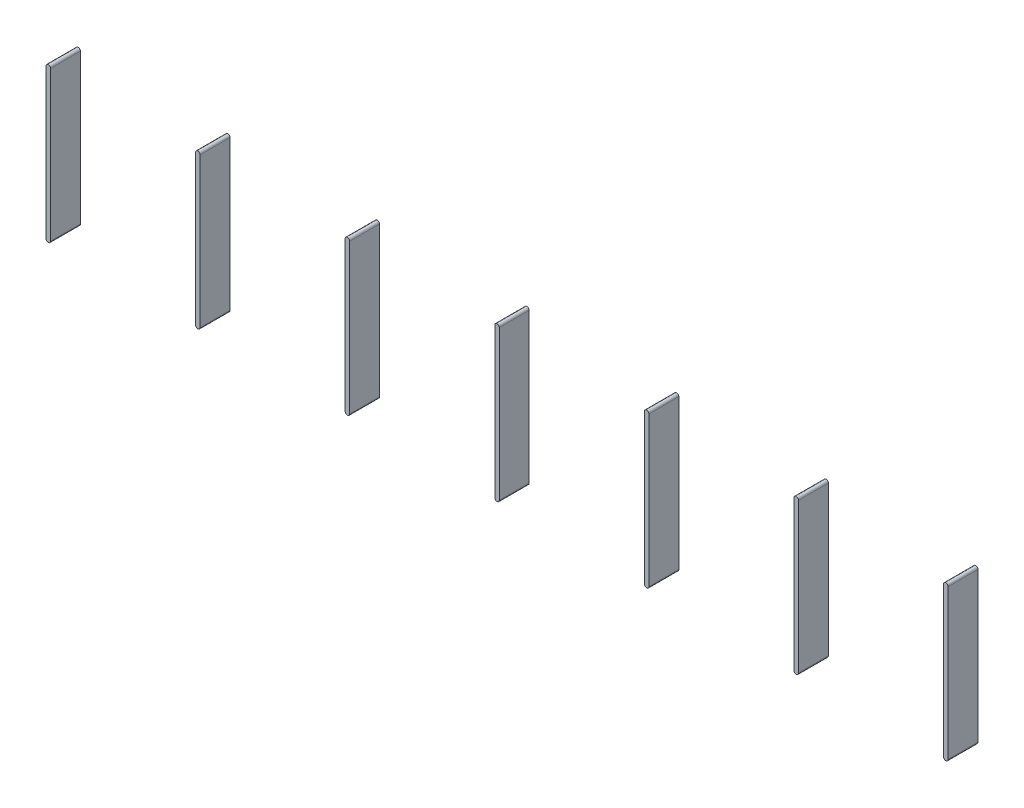
ISO-10303-21;
HEADER;
FILE_DESCRIPTION(('STEP AP214'),'2;1');
FILE_NAME('part.step','',(''),(''),'','','');
FILE_SCHEMA(('AUTOMOTIVE_DESIGN { 1 0 10303 214 1 1 1 1 }'));
ENDSEC;
DATA;
#1=APPLICATION_CONTEXT('core data for automotive mechanical design processes');
#2=APPLICATION_PROTOCOL_DEFINITION('international standard','automotive_design',2000,#1);
#3=PRODUCT_CONTEXT('',#1,'mechanical');
#4=PRODUCT('Part','Part','',(#3));
#5=PRODUCT_RELATED_PRODUCT_CATEGORY('part','',(#4));
#6=PRODUCT_DEFINITION_FORMATION('','',#4);
#7=PRODUCT_DEFINITION_CONTEXT('part definition',#1,'design');
#8=PRODUCT_DEFINITION('design','',#6,#7);
#9=PRODUCT_DEFINITION_SHAPE('','',#8);
#10=(LENGTH_UNIT() NAMED_UNIT(*) SI_UNIT(.MILLI.,.METRE.));
#11=(NAMED_UNIT(*) PLANE_ANGLE_UNIT() SI_UNIT($,.RADIAN.));
#12=(NAMED_UNIT(*) SI_UNIT($,.STERADIAN.) SOLID_ANGLE_UNIT());
#13=UNCERTAINTY_MEASURE_WITH_UNIT(LENGTH_MEASURE(1.E-05),#10,'distance_accuracy_value','');
#14=(GEOMETRIC_REPRESENTATION_CONTEXT(3) GLOBAL_UNCERTAINTY_ASSIGNED_CONTEXT((#13)) GLOBAL_UNIT_ASSIGNED_CONTEXT((#10,
#11,#12)) REPRESENTATION_CONTEXT('',''));
#15=CARTESIAN_POINT('',(0.,0.,0.));
#16=DIRECTION('',(0.,0.,1.));
#17=DIRECTION('',(1.,0.,0.));
#18=AXIS2_PLACEMENT_3D('',#15,#16,#17);
#19=CARTESIAN_POINT('',(-80.,0.,4.));
#20=DIRECTION('',(0.,0.,-1.));
#21=DIRECTION('',(-1.,0.,0.));
#22=AXIS2_PLACEMENT_3D('',#19,#20,#21);
#23=CYLINDRICAL_SURFACE('',#22,0.299999999999995);
#24=CARTESIAN_POINT('',(-80.,0.,0.));
#25=DIRECTION('',(0.,0.,1.));
#26=DIRECTION('',(1.,0.,0.));
#27=AXIS2_PLACEMENT_3D('',#24,#25,#26);
#28=CIRCLE('',#27,0.299999999999995);
#29=CARTESIAN_POINT('',(-79.7,0.,0.));
#30=VERTEX_POINT('',#29);
#31=CARTESIAN_POINT('',(-80.3,0.,0.));
#32=VERTEX_POINT('',#31);
#33=EDGE_CURVE('E107',#30,#32,#28,.T.);
#34=ORIENTED_EDGE('',*,*,#33,.T.);
#35=DIRECTION('',(0.,0.,-1.));
#36=VECTOR('',#35,1.);
#37=CARTESIAN_POINT('',(-80.3,0.,4.));
#38=LINE('',#37,#36);
#39=CARTESIAN_POINT('',(-80.3,0.,4.));
#40=VERTEX_POINT('',#39);
#41=EDGE_CURVE('E12',#40,#32,#38,.T.);
#42=ORIENTED_EDGE('',*,*,#41,.F.);
#43=CARTESIAN_POINT('',(-80.,0.,4.));
#44=DIRECTION('',(0.,0.,1.));
#45=DIRECTION('',(1.,0.,0.));
#46=AXIS2_PLACEMENT_3D('',#43,#44,#45);
#47=CIRCLE('',#46,0.299999999999995);
#48=CARTESIAN_POINT('',(-79.7,0.,4.));
#49=VERTEX_POINT('',#48);
#50=EDGE_CURVE('E95',#49,#40,#47,.T.);
#51=ORIENTED_EDGE('',*,*,#50,.F.);
#52=DIRECTION('',(0.,0.,-1.));
#53=VECTOR('',#52,1.);
#54=CARTESIAN_POINT('',(-79.7,0.,4.));
#55=LINE('',#54,#53);
#56=EDGE_CURVE('E103',#49,#30,#55,.T.);
#57=ORIENTED_EDGE('',*,*,#56,.T.);
#58=EDGE_LOOP('',(#34,#42,#51,#57));
#59=FACE_BOUND('',#58,.T.);
#60=ADVANCED_FACE('F44',(#59),#23,.T.);
#61=CARTESIAN_POINT('',(-80.3,0.,4.));
#62=DIRECTION('',(1.,0.,0.));
#63=DIRECTION('',(0.,0.,-1.));
#64=AXIS2_PLACEMENT_3D('',#61,#62,#63);
#65=PLANE('',#64);
#66=DIRECTION('',(0.,-1.,0.));
#67=VECTOR('',#66,1.);
#68=CARTESIAN_POINT('',(-80.3,0.,0.));
#69=LINE('',#68,#67);
#70=CARTESIAN_POINT('',(-80.3,-20.,0.));
#71=VERTEX_POINT('',#70);
#72=EDGE_CURVE('E99',#32,#71,#69,.T.);
#73=ORIENTED_EDGE('',*,*,#72,.T.);
#74=DIRECTION('',(0.,0.,-1.));
#75=VECTOR('',#74,1.);
#76=CARTESIAN_POINT('',(-80.3,-20.,4.));
#77=LINE('',#76,#75);
#78=CARTESIAN_POINT('',(-80.3,-20.,4.));
#79=VERTEX_POINT('',#78);
#80=EDGE_CURVE('E52',#79,#71,#77,.T.);
#81=ORIENTED_EDGE('',*,*,#80,.F.);
#82=DIRECTION('',(0.,-1.,0.));
#83=VECTOR('',#82,1.);
#84=CARTESIAN_POINT('',(-80.3,0.,4.));
#85=LINE('',#84,#83);
#86=EDGE_CURVE('E90',#40,#79,#85,.T.);
#87=ORIENTED_EDGE('',*,*,#86,.F.);
#88=ORIENTED_EDGE('',*,*,#41,.T.);
#89=EDGE_LOOP('',(#73,#81,#87,#88));
#90=FACE_BOUND('',#89,.T.);
#91=ADVANCED_FACE('F98',(#90),#65,.F.);
#92=CARTESIAN_POINT('',(-80.,-20.,4.));
#93=DIRECTION('',(0.,0.,-1.));
#94=DIRECTION('',(-1.,0.,0.));
#95=AXIS2_PLACEMENT_3D('',#92,#93,#94);
#96=CYLINDRICAL_SURFACE('',#95,0.299999999999995);
#97=CARTESIAN_POINT('',(-80.,-20.,0.));
#98=DIRECTION('',(0.,0.,1.));
#99=DIRECTION('',(1.,0.,0.));
#100=AXIS2_PLACEMENT_3D('',#97,#98,#99);
#101=CIRCLE('',#100,0.299999999999995);
#102=CARTESIAN_POINT('',(-79.7,-20.,0.));
#103=VERTEX_POINT('',#102);
#104=EDGE_CURVE('E77',#71,#103,#101,.T.);
#105=ORIENTED_EDGE('',*,*,#104,.T.);
#106=DIRECTION('',(0.,0.,-1.));
#107=VECTOR('',#106,1.);
#108=CARTESIAN_POINT('',(-79.7,-20.,4.));
#109=LINE('',#108,#107);
#110=CARTESIAN_POINT('',(-79.7,-20.,4.));
#111=VERTEX_POINT('',#110);
#112=EDGE_CURVE('E100',#111,#103,#109,.T.);
#113=ORIENTED_EDGE('',*,*,#112,.F.);
#114=CARTESIAN_POINT('',(-80.,-20.,4.));
#115=DIRECTION('',(0.,0.,1.));
#116=DIRECTION('',(1.,0.,0.));
#117=AXIS2_PLACEMENT_3D('',#114,#115,#116);
#118=CIRCLE('',#117,0.299999999999995);
#119=EDGE_CURVE('E93',#79,#111,#118,.T.);
#120=ORIENTED_EDGE('',*,*,#119,.F.);
#121=ORIENTED_EDGE('',*,*,#80,.T.);
#122=EDGE_LOOP('',(#105,#113,#120,#121));
#123=FACE_BOUND('',#122,.T.);
#124=ADVANCED_FACE('F101',(#123),#96,.T.);
#125=CARTESIAN_POINT('',(-79.7,0.,4.));
#126=DIRECTION('',(-1.,0.,0.));
#127=DIRECTION('',(0.,0.,1.));
#128=AXIS2_PLACEMENT_3D('',#125,#126,#127);
#129=PLANE('',#128);
#130=DIRECTION('',(0.,1.,0.));
#131=VECTOR('',#130,1.);
#132=CARTESIAN_POINT('',(-79.7,0.,0.));
#133=LINE('',#132,#131);
#134=EDGE_CURVE('E83',#103,#30,#133,.T.);
#135=ORIENTED_EDGE('',*,*,#134,.T.);
#136=ORIENTED_EDGE('',*,*,#56,.F.);
#137=DIRECTION('',(0.,1.,0.));
#138=VECTOR('',#137,1.);
#139=CARTESIAN_POINT('',(-79.7,0.,4.));
#140=LINE('',#139,#138);
#141=EDGE_CURVE('E60',#111,#49,#140,.T.);
#142=ORIENTED_EDGE('',*,*,#141,.F.);
#143=ORIENTED_EDGE('',*,*,#112,.T.);
#144=EDGE_LOOP('',(#135,#136,#142,#143));
#145=FACE_BOUND('',#144,.T.);
#146=ADVANCED_FACE('F114',(#145),#129,.F.);
#147=CARTESIAN_POINT('',(-80.,0.,4.));
#148=DIRECTION('',(0.,0.,1.));
#149=DIRECTION('',(1.,0.,0.));
#150=AXIS2_PLACEMENT_3D('',#147,#148,#149);
#151=PLANE('',#150);
#152=ORIENTED_EDGE('',*,*,#50,.T.);
#153=ORIENTED_EDGE('',*,*,#86,.T.);
#154=ORIENTED_EDGE('',*,*,#119,.T.);
#155=ORIENTED_EDGE('',*,*,#141,.T.);
#156=EDGE_LOOP('',(#152,#153,#154,#155));
#157=FACE_BOUND('',#156,.T.);
#158=ADVANCED_FACE('F91',(#157),#151,.T.);
#159=CARTESIAN_POINT('',(-80.,0.,0.));
#160=DIRECTION('',(0.,0.,1.));
#161=DIRECTION('',(1.,0.,0.));
#162=AXIS2_PLACEMENT_3D('',#159,#160,#161);
#163=PLANE('',#162);
#164=ORIENTED_EDGE('',*,*,#33,.F.);
#165=ORIENTED_EDGE('',*,*,#134,.F.);
#166=ORIENTED_EDGE('',*,*,#104,.F.);
#167=ORIENTED_EDGE('',*,*,#72,.F.);
#168=EDGE_LOOP('',(#164,#165,#166,#167));
#169=FACE_BOUND('',#168,.T.);
#170=ADVANCED_FACE('F117',(#169),#163,.F.);
#171=CLOSED_SHELL('',(#60,#91,#124,#146,#158,#170));
#172=MANIFOLD_SOLID_BREP('B2',#171);
#173=CARTESIAN_POINT('',(-60.,0.,4.));
#174=DIRECTION('',(0.,0.,-1.));
#175=DIRECTION('',(-1.,0.,0.));
#176=AXIS2_PLACEMENT_3D('',#173,#174,#175);
#177=CYLINDRICAL_SURFACE('',#176,0.300000000000002);
#178=CARTESIAN_POINT('',(-60.,0.,0.));
#179=DIRECTION('',(0.,0.,1.));
#180=DIRECTION('',(1.,0.,0.));
#181=AXIS2_PLACEMENT_3D('',#178,#179,#180);
#182=CIRCLE('',#181,0.300000000000002);
#183=CARTESIAN_POINT('',(-59.7,0.,0.));
#184=VERTEX_POINT('',#183);
#185=CARTESIAN_POINT('',(-60.3,0.,0.));
#186=VERTEX_POINT('',#185);
#187=EDGE_CURVE('E241',#184,#186,#182,.T.);
#188=ORIENTED_EDGE('',*,*,#187,.T.);
#189=DIRECTION('',(0.,0.,-1.));
#190=VECTOR('',#189,1.);
#191=CARTESIAN_POINT('',(-60.3,0.,4.));
#192=LINE('',#191,#190);
#193=CARTESIAN_POINT('',(-60.3,0.,4.));
#194=VERTEX_POINT('',#193);
#195=EDGE_CURVE('E42',#194,#186,#192,.T.);
#196=ORIENTED_EDGE('',*,*,#195,.F.);
#197=CARTESIAN_POINT('',(-60.,0.,4.));
#198=DIRECTION('',(0.,0.,1.));
#199=DIRECTION('',(1.,0.,0.));
#200=AXIS2_PLACEMENT_3D('',#197,#198,#199);
#201=CIRCLE('',#200,0.300000000000002);
#202=CARTESIAN_POINT('',(-59.7,0.,4.));
#203=VERTEX_POINT('',#202);
#204=EDGE_CURVE('E229',#203,#194,#201,.T.);
#205=ORIENTED_EDGE('',*,*,#204,.F.);
#206=DIRECTION('',(0.,0.,-1.));
#207=VECTOR('',#206,1.);
#208=CARTESIAN_POINT('',(-59.7,0.,4.));
#209=LINE('',#208,#207);
#210=EDGE_CURVE('E237',#203,#184,#209,.T.);
#211=ORIENTED_EDGE('',*,*,#210,.T.);
#212=EDGE_LOOP('',(#188,#196,#205,#211));
#213=FACE_BOUND('',#212,.T.);
#214=ADVANCED_FACE('F178',(#213),#177,.T.);
#215=CARTESIAN_POINT('',(-60.3,0.,4.));
#216=DIRECTION('',(1.,0.,0.));
#217=DIRECTION('',(0.,0.,-1.));
#218=AXIS2_PLACEMENT_3D('',#215,#216,#217);
#219=PLANE('',#218);
#220=DIRECTION('',(0.,-1.,0.));
#221=VECTOR('',#220,1.);
#222=CARTESIAN_POINT('',(-60.3,0.,0.));
#223=LINE('',#222,#221);
#224=CARTESIAN_POINT('',(-60.3,-20.,0.));
#225=VERTEX_POINT('',#224);
#226=EDGE_CURVE('E233',#186,#225,#223,.T.);
#227=ORIENTED_EDGE('',*,*,#226,.T.);
#228=DIRECTION('',(0.,0.,-1.));
#229=VECTOR('',#228,1.);
#230=CARTESIAN_POINT('',(-60.3,-20.,4.));
#231=LINE('',#230,#229);
#232=CARTESIAN_POINT('',(-60.3,-20.,4.));
#233=VERTEX_POINT('',#232);
#234=EDGE_CURVE('E186',#233,#225,#231,.T.);
#235=ORIENTED_EDGE('',*,*,#234,.F.);
#236=DIRECTION('',(0.,-1.,0.));
#237=VECTOR('',#236,1.);
#238=CARTESIAN_POINT('',(-60.3,0.,4.));
#239=LINE('',#238,#237);
#240=EDGE_CURVE('E224',#194,#233,#239,.T.);
#241=ORIENTED_EDGE('',*,*,#240,.F.);
#242=ORIENTED_EDGE('',*,*,#195,.T.);
#243=EDGE_LOOP('',(#227,#235,#241,#242));
#244=FACE_BOUND('',#243,.T.);
#245=ADVANCED_FACE('F232',(#244),#219,.F.);
#246=CARTESIAN_POINT('',(-60.,-20.,4.));
#247=DIRECTION('',(0.,0.,-1.));
#248=DIRECTION('',(-1.,0.,0.));
#249=AXIS2_PLACEMENT_3D('',#246,#247,#248);
#250=CYLINDRICAL_SURFACE('',#249,0.300000000000005);
#251=CARTESIAN_POINT('',(-60.,-20.,0.));
#252=DIRECTION('',(0.,0.,1.));
#253=DIRECTION('',(1.,0.,0.));
#254=AXIS2_PLACEMENT_3D('',#251,#252,#253);
#255=CIRCLE('',#254,0.300000000000005);
#256=CARTESIAN_POINT('',(-59.7,-20.,0.));
#257=VERTEX_POINT('',#256);
#258=EDGE_CURVE('E211',#225,#257,#255,.T.);
#259=ORIENTED_EDGE('',*,*,#258,.T.);
#260=DIRECTION('',(0.,0.,-1.));
#261=VECTOR('',#260,1.);
#262=CARTESIAN_POINT('',(-59.7,-20.,4.));
#263=LINE('',#262,#261);
#264=CARTESIAN_POINT('',(-59.7,-20.,4.));
#265=VERTEX_POINT('',#264);
#266=EDGE_CURVE('E234',#265,#257,#263,.T.);
#267=ORIENTED_EDGE('',*,*,#266,.F.);
#268=CARTESIAN_POINT('',(-60.,-20.,4.));
#269=DIRECTION('',(0.,0.,1.));
#270=DIRECTION('',(1.,0.,0.));
#271=AXIS2_PLACEMENT_3D('',#268,#269,#270);
#272=CIRCLE('',#271,0.300000000000005);
#273=EDGE_CURVE('E227',#233,#265,#272,.T.);
#274=ORIENTED_EDGE('',*,*,#273,.F.);
#275=ORIENTED_EDGE('',*,*,#234,.T.);
#276=EDGE_LOOP('',(#259,#267,#274,#275));
#277=FACE_BOUND('',#276,.T.);
#278=ADVANCED_FACE('F235',(#277),#250,.T.);
#279=CARTESIAN_POINT('',(-59.7,0.,4.));
#280=DIRECTION('',(-1.,0.,0.));
#281=DIRECTION('',(0.,-1.,0.));
#282=AXIS2_PLACEMENT_3D('',#279,#280,#281);
#283=PLANE('',#282);
#284=DIRECTION('',(0.,1.,0.));
#285=VECTOR('',#284,1.);
#286=CARTESIAN_POINT('',(-59.7,0.,0.));
#287=LINE('',#286,#285);
#288=EDGE_CURVE('E217',#257,#184,#287,.T.);
#289=ORIENTED_EDGE('',*,*,#288,.T.);
#290=ORIENTED_EDGE('',*,*,#210,.F.);
#291=DIRECTION('',(0.,1.,0.));
#292=VECTOR('',#291,1.);
#293=CARTESIAN_POINT('',(-59.7,0.,4.));
#294=LINE('',#293,#292);
#295=EDGE_CURVE('E194',#265,#203,#294,.T.);
#296=ORIENTED_EDGE('',*,*,#295,.F.);
#297=ORIENTED_EDGE('',*,*,#266,.T.);
#298=EDGE_LOOP('',(#289,#290,#296,#297));
#299=FACE_BOUND('',#298,.T.);
#300=ADVANCED_FACE('F248',(#299),#283,.F.);
#301=CARTESIAN_POINT('',(-60.,0.,4.));
#302=DIRECTION('',(0.,0.,1.));
#303=DIRECTION('',(1.,0.,0.));
#304=AXIS2_PLACEMENT_3D('',#301,#302,#303);
#305=PLANE('',#304);
#306=ORIENTED_EDGE('',*,*,#204,.T.);
#307=ORIENTED_EDGE('',*,*,#240,.T.);
#308=ORIENTED_EDGE('',*,*,#273,.T.);
#309=ORIENTED_EDGE('',*,*,#295,.T.);
#310=EDGE_LOOP('',(#306,#307,#308,#309));
#311=FACE_BOUND('',#310,.T.);
#312=ADVANCED_FACE('F225',(#311),#305,.T.);
#313=CARTESIAN_POINT('',(-60.,0.,0.));
#314=DIRECTION('',(0.,0.,1.));
#315=DIRECTION('',(1.,0.,0.));
#316=AXIS2_PLACEMENT_3D('',#313,#314,#315);
#317=PLANE('',#316);
#318=ORIENTED_EDGE('',*,*,#187,.F.);
#319=ORIENTED_EDGE('',*,*,#288,.F.);
#320=ORIENTED_EDGE('',*,*,#258,.F.);
#321=ORIENTED_EDGE('',*,*,#226,.F.);
#322=EDGE_LOOP('',(#318,#319,#320,#321));
#323=FACE_BOUND('',#322,.T.);
#324=ADVANCED_FACE('F251',(#323),#317,.F.);
#325=CLOSED_SHELL('',(#214,#245,#278,#300,#312,#324));
#326=MANIFOLD_SOLID_BREP('B6',#325);
#327=CARTESIAN_POINT('',(-40.,0.,4.));
#328=DIRECTION('',(0.,0.,-1.));
#329=DIRECTION('',(-1.,0.,0.));
#330=AXIS2_PLACEMENT_3D('',#327,#328,#329);
#331=CYLINDRICAL_SURFACE('',#330,0.300000000000002);
#332=CARTESIAN_POINT('',(-40.,0.,0.));
#333=DIRECTION('',(0.,0.,1.));
#334=DIRECTION('',(1.,0.,0.));
#335=AXIS2_PLACEMENT_3D('',#332,#333,#334);
#336=CIRCLE('',#335,0.300000000000002);
#337=CARTESIAN_POINT('',(-39.7,0.,0.));
#338=VERTEX_POINT('',#337);
#339=CARTESIAN_POINT('',(-40.3,0.,0.));
#340=VERTEX_POINT('',#339);
#341=EDGE_CURVE('E375',#338,#340,#336,.T.);
#342=ORIENTED_EDGE('',*,*,#341,.T.);
#343=DIRECTION('',(0.,0.,-1.));
#344=VECTOR('',#343,1.);
#345=CARTESIAN_POINT('',(-40.3,0.,4.));
#346=LINE('',#345,#344);
#347=CARTESIAN_POINT('',(-40.3,0.,4.));
#348=VERTEX_POINT('',#347);
#349=EDGE_CURVE('E176',#348,#340,#346,.T.);
#350=ORIENTED_EDGE('',*,*,#349,.F.);
#351=CARTESIAN_POINT('',(-40.,0.,4.));
#352=DIRECTION('',(0.,0.,1.));
#353=DIRECTION('',(1.,0.,0.));
#354=AXIS2_PLACEMENT_3D('',#351,#352,#353);
#355=CIRCLE('',#354,0.300000000000002);
#356=CARTESIAN_POINT('',(-39.7,0.,4.));
#357=VERTEX_POINT('',#356);
#358=EDGE_CURVE('E363',#357,#348,#355,.T.);
#359=ORIENTED_EDGE('',*,*,#358,.F.);
#360=DIRECTION('',(0.,0.,-1.));
#361=VECTOR('',#360,1.);
#362=CARTESIAN_POINT('',(-39.7,0.,4.));
#363=LINE('',#362,#361);
#364=EDGE_CURVE('E371',#357,#338,#363,.T.);
#365=ORIENTED_EDGE('',*,*,#364,.T.);
#366=EDGE_LOOP('',(#342,#350,#359,#365));
#367=FACE_BOUND('',#366,.T.);
#368=ADVANCED_FACE('F312',(#367),#331,.T.);
#369=CARTESIAN_POINT('',(-40.3,0.,4.));
#370=DIRECTION('',(1.,0.,0.));
#371=DIRECTION('',(0.,0.,-1.));
#372=AXIS2_PLACEMENT_3D('',#369,#370,#371);
#373=PLANE('',#372);
#374=DIRECTION('',(0.,-1.,0.));
#375=VECTOR('',#374,1.);
#376=CARTESIAN_POINT('',(-40.3,0.,0.));
#377=LINE('',#376,#375);
#378=CARTESIAN_POINT('',(-40.3,-20.,0.));
#379=VERTEX_POINT('',#378);
#380=EDGE_CURVE('E367',#340,#379,#377,.T.);
#381=ORIENTED_EDGE('',*,*,#380,.T.);
#382=DIRECTION('',(0.,0.,-1.));
#383=VECTOR('',#382,1.);
#384=CARTESIAN_POINT('',(-40.3,-20.,4.));
#385=LINE('',#384,#383);
#386=CARTESIAN_POINT('',(-40.3,-20.,4.));
#387=VERTEX_POINT('',#386);
#388=EDGE_CURVE('E320',#387,#379,#385,.T.);
#389=ORIENTED_EDGE('',*,*,#388,.F.);
#390=DIRECTION('',(0.,-1.,0.));
#391=VECTOR('',#390,1.);
#392=CARTESIAN_POINT('',(-40.3,0.,4.));
#393=LINE('',#392,#391);
#394=EDGE_CURVE('E358',#348,#387,#393,.T.);
#395=ORIENTED_EDGE('',*,*,#394,.F.);
#396=ORIENTED_EDGE('',*,*,#349,.T.);
#397=EDGE_LOOP('',(#381,#389,#395,#396));
#398=FACE_BOUND('',#397,.T.);
#399=ADVANCED_FACE('F366',(#398),#373,.F.);
#400=CARTESIAN_POINT('',(-40.,-20.,4.));
#401=DIRECTION('',(0.,0.,-1.));
#402=DIRECTION('',(-1.,0.,0.));
#403=AXIS2_PLACEMENT_3D('',#400,#401,#402);
#404=CYLINDRICAL_SURFACE('',#403,0.300000000000005);
#405=CARTESIAN_POINT('',(-40.,-20.,0.));
#406=DIRECTION('',(0.,0.,1.));
#407=DIRECTION('',(1.,0.,0.));
#408=AXIS2_PLACEMENT_3D('',#405,#406,#407);
#409=CIRCLE('',#408,0.300000000000005);
#410=CARTESIAN_POINT('',(-39.7,-20.,0.));
#411=VERTEX_POINT('',#410);
#412=EDGE_CURVE('E345',#379,#411,#409,.T.);
#413=ORIENTED_EDGE('',*,*,#412,.T.);
#414=DIRECTION('',(0.,0.,-1.));
#415=VECTOR('',#414,1.);
#416=CARTESIAN_POINT('',(-39.7,-20.,4.));
#417=LINE('',#416,#415);
#418=CARTESIAN_POINT('',(-39.7,-20.,4.));
#419=VERTEX_POINT('',#418);
#420=EDGE_CURVE('E368',#419,#411,#417,.T.);
#421=ORIENTED_EDGE('',*,*,#420,.F.);
#422=CARTESIAN_POINT('',(-40.,-20.,4.));
#423=DIRECTION('',(0.,0.,1.));
#424=DIRECTION('',(1.,0.,0.));
#425=AXIS2_PLACEMENT_3D('',#422,#423,#424);
#426=CIRCLE('',#425,0.300000000000005);
#427=EDGE_CURVE('E361',#387,#419,#426,.T.);
#428=ORIENTED_EDGE('',*,*,#427,.F.);
#429=ORIENTED_EDGE('',*,*,#388,.T.);
#430=EDGE_LOOP('',(#413,#421,#428,#429));
#431=FACE_BOUND('',#430,.T.);
#432=ADVANCED_FACE('F369',(#431),#404,.T.);
#433=CARTESIAN_POINT('',(-39.7,0.,4.));
#434=DIRECTION('',(-1.,0.,0.));
#435=DIRECTION('',(0.,-1.,0.));
#436=AXIS2_PLACEMENT_3D('',#433,#434,#435);
#437=PLANE('',#436);
#438=DIRECTION('',(0.,1.,0.));
#439=VECTOR('',#438,1.);
#440=CARTESIAN_POINT('',(-39.7,0.,0.));
#441=LINE('',#440,#439);
#442=EDGE_CURVE('E351',#411,#338,#441,.T.);
#443=ORIENTED_EDGE('',*,*,#442,.T.);
#444=ORIENTED_EDGE('',*,*,#364,.F.);
#445=DIRECTION('',(0.,1.,0.));
#446=VECTOR('',#445,1.);
#447=CARTESIAN_POINT('',(-39.7,0.,4.));
#448=LINE('',#447,#446);
#449=EDGE_CURVE('E328',#419,#357,#448,.T.);
#450=ORIENTED_EDGE('',*,*,#449,.F.);
#451=ORIENTED_EDGE('',*,*,#420,.T.);
#452=EDGE_LOOP('',(#443,#444,#450,#451));
#453=FACE_BOUND('',#452,.T.);
#454=ADVANCED_FACE('F382',(#453),#437,.F.);
#455=CARTESIAN_POINT('',(-40.,0.,4.));
#456=DIRECTION('',(0.,0.,1.));
#457=DIRECTION('',(1.,0.,0.));
#458=AXIS2_PLACEMENT_3D('',#455,#456,#457);
#459=PLANE('',#458);
#460=ORIENTED_EDGE('',*,*,#358,.T.);
#461=ORIENTED_EDGE('',*,*,#394,.T.);
#462=ORIENTED_EDGE('',*,*,#427,.T.);
#463=ORIENTED_EDGE('',*,*,#449,.T.);
#464=EDGE_LOOP('',(#460,#461,#462,#463));
#465=FACE_BOUND('',#464,.T.);
#466=ADVANCED_FACE('F359',(#465),#459,.T.);
#467=CARTESIAN_POINT('',(-40.,0.,0.));
#468=DIRECTION('',(0.,0.,1.));
#469=DIRECTION('',(1.,0.,0.));
#470=AXIS2_PLACEMENT_3D('',#467,#468,#469);
#471=PLANE('',#470);
#472=ORIENTED_EDGE('',*,*,#341,.F.);
#473=ORIENTED_EDGE('',*,*,#442,.F.);
#474=ORIENTED_EDGE('',*,*,#412,.F.);
#475=ORIENTED_EDGE('',*,*,#380,.F.);
#476=EDGE_LOOP('',(#472,#473,#474,#475));
#477=FACE_BOUND('',#476,.T.);
#478=ADVANCED_FACE('F385',(#477),#471,.F.);
#479=CLOSED_SHELL('',(#368,#399,#432,#454,#466,#478));
#480=MANIFOLD_SOLID_BREP('B36',#479);
#481=CARTESIAN_POINT('',(-20.,0.,4.));
#482=DIRECTION('',(0.,0.,-1.));
#483=DIRECTION('',(-1.,0.,0.));
#484=AXIS2_PLACEMENT_3D('',#481,#482,#483);
#485=CYLINDRICAL_SURFACE('',#484,0.300000000000002);
#486=CARTESIAN_POINT('',(-20.,0.,0.));
#487=DIRECTION('',(0.,0.,1.));
#488=DIRECTION('',(1.,0.,0.));
#489=AXIS2_PLACEMENT_3D('',#486,#487,#488);
#490=CIRCLE('',#489,0.300000000000002);
#491=CARTESIAN_POINT('',(-19.7,0.,0.));
#492=VERTEX_POINT('',#491);
#493=CARTESIAN_POINT('',(-20.3,0.,0.));
#494=VERTEX_POINT('',#493);
#495=EDGE_CURVE('E509',#492,#494,#490,.T.);
#496=ORIENTED_EDGE('',*,*,#495,.T.);
#497=DIRECTION('',(0.,0.,-1.));
#498=VECTOR('',#497,1.);
#499=CARTESIAN_POINT('',(-20.3,0.,4.));
#500=LINE('',#499,#498);
#501=CARTESIAN_POINT('',(-20.3,0.,4.));
#502=VERTEX_POINT('',#501);
#503=EDGE_CURVE('E310',#502,#494,#500,.T.);
#504=ORIENTED_EDGE('',*,*,#503,.F.);
#505=CARTESIAN_POINT('',(-20.,0.,4.));
#506=DIRECTION('',(0.,0.,1.));
#507=DIRECTION('',(1.,0.,0.));
#508=AXIS2_PLACEMENT_3D('',#505,#506,#507);
#509=CIRCLE('',#508,0.300000000000002);
#510=CARTESIAN_POINT('',(-19.7,0.,4.));
#511=VERTEX_POINT('',#510);
#512=EDGE_CURVE('E497',#511,#502,#509,.T.);
#513=ORIENTED_EDGE('',*,*,#512,.F.);
#514=DIRECTION('',(0.,0.,-1.));
#515=VECTOR('',#514,1.);
#516=CARTESIAN_POINT('',(-19.7,0.,4.));
#517=LINE('',#516,#515);
#518=EDGE_CURVE('E505',#511,#492,#517,.T.);
#519=ORIENTED_EDGE('',*,*,#518,.T.);
#520=EDGE_LOOP('',(#496,#504,#513,#519));
#521=FACE_BOUND('',#520,.T.);
#522=ADVANCED_FACE('F446',(#521),#485,.T.);
#523=CARTESIAN_POINT('',(-20.3,0.,4.));
#524=DIRECTION('',(1.,0.,0.));
#525=DIRECTION('',(0.,0.,-1.));
#526=AXIS2_PLACEMENT_3D('',#523,#524,#525);
#527=PLANE('',#526);
#528=DIRECTION('',(0.,-1.,0.));
#529=VECTOR('',#528,1.);
#530=CARTESIAN_POINT('',(-20.3,0.,0.));
#531=LINE('',#530,#529);
#532=CARTESIAN_POINT('',(-20.3,-20.,0.));
#533=VERTEX_POINT('',#532);
#534=EDGE_CURVE('E501',#494,#533,#531,.T.);
#535=ORIENTED_EDGE('',*,*,#534,.T.);
#536=DIRECTION('',(0.,0.,-1.));
#537=VECTOR('',#536,1.);
#538=CARTESIAN_POINT('',(-20.3,-20.,4.));
#539=LINE('',#538,#537);
#540=CARTESIAN_POINT('',(-20.3,-20.,4.));
#541=VERTEX_POINT('',#540);
#542=EDGE_CURVE('E454',#541,#533,#539,.T.);
#543=ORIENTED_EDGE('',*,*,#542,.F.);
#544=DIRECTION('',(0.,-1.,0.));
#545=VECTOR('',#544,1.);
#546=CARTESIAN_POINT('',(-20.3,0.,4.));
#547=LINE('',#546,#545);
#548=EDGE_CURVE('E492',#502,#541,#547,.T.);
#549=ORIENTED_EDGE('',*,*,#548,.F.);
#550=ORIENTED_EDGE('',*,*,#503,.T.);
#551=EDGE_LOOP('',(#535,#543,#549,#550));
#552=FACE_BOUND('',#551,.T.);
#553=ADVANCED_FACE('F500',(#552),#527,.F.);
#554=CARTESIAN_POINT('',(-20.,-20.,4.));
#555=DIRECTION('',(0.,0.,-1.));
#556=DIRECTION('',(-1.,0.,0.));
#557=AXIS2_PLACEMENT_3D('',#554,#555,#556);
#558=CYLINDRICAL_SURFACE('',#557,0.300000000000003);
#559=CARTESIAN_POINT('',(-20.,-20.,0.));
#560=DIRECTION('',(0.,0.,1.));
#561=DIRECTION('',(1.,0.,0.));
#562=AXIS2_PLACEMENT_3D('',#559,#560,#561);
#563=CIRCLE('',#562,0.300000000000003);
#564=CARTESIAN_POINT('',(-19.7,-20.,0.));
#565=VERTEX_POINT('',#564);
#566=EDGE_CURVE('E479',#533,#565,#563,.T.);
#567=ORIENTED_EDGE('',*,*,#566,.T.);
#568=DIRECTION('',(0.,0.,-1.));
#569=VECTOR('',#568,1.);
#570=CARTESIAN_POINT('',(-19.7,-20.,4.));
#571=LINE('',#570,#569);
#572=CARTESIAN_POINT('',(-19.7,-20.,4.));
#573=VERTEX_POINT('',#572);
#574=EDGE_CURVE('E502',#573,#565,#571,.T.);
#575=ORIENTED_EDGE('',*,*,#574,.F.);
#576=CARTESIAN_POINT('',(-20.,-20.,4.));
#577=DIRECTION('',(0.,0.,1.));
#578=DIRECTION('',(1.,0.,0.));
#579=AXIS2_PLACEMENT_3D('',#576,#577,#578);
#580=CIRCLE('',#579,0.300000000000003);
#581=EDGE_CURVE('E495',#541,#573,#580,.T.);
#582=ORIENTED_EDGE('',*,*,#581,.F.);
#583=ORIENTED_EDGE('',*,*,#542,.T.);
#584=EDGE_LOOP('',(#567,#575,#582,#583));
#585=FACE_BOUND('',#584,.T.);
#586=ADVANCED_FACE('F503',(#585),#558,.T.);
#587=CARTESIAN_POINT('',(-19.7,0.,4.));
#588=DIRECTION('',(-1.,0.,0.));
#589=DIRECTION('',(0.,-1.,0.));
#590=AXIS2_PLACEMENT_3D('',#587,#588,#589);
#591=PLANE('',#590);
#592=DIRECTION('',(0.,1.,0.));
#593=VECTOR('',#592,1.);
#594=CARTESIAN_POINT('',(-19.7,0.,0.));
#595=LINE('',#594,#593);
#596=EDGE_CURVE('E485',#565,#492,#595,.T.);
#597=ORIENTED_EDGE('',*,*,#596,.T.);
#598=ORIENTED_EDGE('',*,*,#518,.F.);
#599=DIRECTION('',(0.,1.,0.));
#600=VECTOR('',#599,1.);
#601=CARTESIAN_POINT('',(-19.7,0.,4.));
#602=LINE('',#601,#600);
#603=EDGE_CURVE('E462',#573,#511,#602,.T.);
#604=ORIENTED_EDGE('',*,*,#603,.F.);
#605=ORIENTED_EDGE('',*,*,#574,.T.);
#606=EDGE_LOOP('',(#597,#598,#604,#605));
#607=FACE_BOUND('',#606,.T.);
#608=ADVANCED_FACE('F516',(#607),#591,.F.);
#609=CARTESIAN_POINT('',(-20.,0.,4.));
#610=DIRECTION('',(0.,0.,1.));
#611=DIRECTION('',(1.,0.,0.));
#612=AXIS2_PLACEMENT_3D('',#609,#610,#611);
#613=PLANE('',#612);
#614=ORIENTED_EDGE('',*,*,#512,.T.);
#615=ORIENTED_EDGE('',*,*,#548,.T.);
#616=ORIENTED_EDGE('',*,*,#581,.T.);
#617=ORIENTED_EDGE('',*,*,#603,.T.);
#618=EDGE_LOOP('',(#614,#615,#616,#617));
#619=FACE_BOUND('',#618,.T.);
#620=ADVANCED_FACE('F493',(#619),#613,.T.);
#621=CARTESIAN_POINT('',(-20.,0.,0.));
#622=DIRECTION('',(0.,0.,1.));
#623=DIRECTION('',(1.,0.,0.));
#624=AXIS2_PLACEMENT_3D('',#621,#622,#623);
#625=PLANE('',#624);
#626=ORIENTED_EDGE('',*,*,#495,.F.);
#627=ORIENTED_EDGE('',*,*,#596,.F.);
#628=ORIENTED_EDGE('',*,*,#566,.F.);
#629=ORIENTED_EDGE('',*,*,#534,.F.);
#630=EDGE_LOOP('',(#626,#627,#628,#629));
#631=FACE_BOUND('',#630,.T.);
#632=ADVANCED_FACE('F519',(#631),#625,.F.);
#633=CLOSED_SHELL('',(#522,#553,#586,#608,#620,#632));
#634=MANIFOLD_SOLID_BREP('B170',#633);
#635=CARTESIAN_POINT('',(20.,0.,4.));
#636=DIRECTION('',(0.,0.,-1.));
#637=DIRECTION('',(-1.,0.,0.));
#638=AXIS2_PLACEMENT_3D('',#635,#636,#637);
#639=CYLINDRICAL_SURFACE('',#638,0.300000000000002);
#640=CARTESIAN_POINT('',(20.,0.,0.));
#641=DIRECTION('',(0.,0.,1.));
#642=DIRECTION('',(1.,0.,0.));
#643=AXIS2_PLACEMENT_3D('',#640,#641,#642);
#644=CIRCLE('',#643,0.300000000000002);
#645=CARTESIAN_POINT('',(20.3,0.,0.));
#646=VERTEX_POINT('',#645);
#647=CARTESIAN_POINT('',(19.7,0.,0.));
#648=VERTEX_POINT('',#647);
#649=EDGE_CURVE('E643',#646,#648,#644,.T.);
#650=ORIENTED_EDGE('',*,*,#649,.T.);
#651=DIRECTION('',(0.,0.,-1.));
#652=VECTOR('',#651,1.);
#653=CARTESIAN_POINT('',(19.7,0.,4.));
#654=LINE('',#653,#652);
#655=CARTESIAN_POINT('',(19.7,0.,4.));
#656=VERTEX_POINT('',#655);
#657=EDGE_CURVE('E444',#656,#648,#654,.T.);
#658=ORIENTED_EDGE('',*,*,#657,.F.);
#659=CARTESIAN_POINT('',(20.,0.,4.));
#660=DIRECTION('',(0.,0.,1.));
#661=DIRECTION('',(1.,0.,0.));
#662=AXIS2_PLACEMENT_3D('',#659,#660,#661);
#663=CIRCLE('',#662,0.300000000000002);
#664=CARTESIAN_POINT('',(20.3,0.,4.));
#665=VERTEX_POINT('',#664);
#666=EDGE_CURVE('E631',#665,#656,#663,.T.);
#667=ORIENTED_EDGE('',*,*,#666,.F.);
#668=DIRECTION('',(0.,0.,-1.));
#669=VECTOR('',#668,1.);
#670=CARTESIAN_POINT('',(20.3,0.,4.));
#671=LINE('',#670,#669);
#672=EDGE_CURVE('E639',#665,#646,#671,.T.);
#673=ORIENTED_EDGE('',*,*,#672,.T.);
#674=EDGE_LOOP('',(#650,#658,#667,#673));
#675=FACE_BOUND('',#674,.T.);
#676=ADVANCED_FACE('F580',(#675),#639,.T.);
#677=CARTESIAN_POINT('',(19.7,0.,4.));
#678=DIRECTION('',(1.,0.,0.));
#679=DIRECTION('',(0.,0.,-1.));
#680=AXIS2_PLACEMENT_3D('',#677,#678,#679);
#681=PLANE('',#680);
#682=DIRECTION('',(0.,-1.,0.));
#683=VECTOR('',#682,1.);
#684=CARTESIAN_POINT('',(19.7,0.,0.));
#685=LINE('',#684,#683);
#686=CARTESIAN_POINT('',(19.7,-20.,0.));
#687=VERTEX_POINT('',#686);
#688=EDGE_CURVE('E635',#648,#687,#685,.T.);
#689=ORIENTED_EDGE('',*,*,#688,.T.);
#690=DIRECTION('',(0.,0.,-1.));
#691=VECTOR('',#690,1.);
#692=CARTESIAN_POINT('',(19.7,-20.,4.));
#693=LINE('',#692,#691);
#694=CARTESIAN_POINT('',(19.7,-20.,4.));
#695=VERTEX_POINT('',#694);
#696=EDGE_CURVE('E588',#695,#687,#693,.T.);
#697=ORIENTED_EDGE('',*,*,#696,.F.);
#698=DIRECTION('',(0.,-1.,0.));
#699=VECTOR('',#698,1.);
#700=CARTESIAN_POINT('',(19.7,0.,4.));
#701=LINE('',#700,#699);
#702=EDGE_CURVE('E626',#656,#695,#701,.T.);
#703=ORIENTED_EDGE('',*,*,#702,.F.);
#704=ORIENTED_EDGE('',*,*,#657,.T.);
#705=EDGE_LOOP('',(#689,#697,#703,#704));
#706=FACE_BOUND('',#705,.T.);
#707=ADVANCED_FACE('F634',(#706),#681,.F.);
#708=CARTESIAN_POINT('',(20.,-20.,4.));
#709=DIRECTION('',(0.,0.,-1.));
#710=DIRECTION('',(-1.,0.,0.));
#711=AXIS2_PLACEMENT_3D('',#708,#709,#710);
#712=CYLINDRICAL_SURFACE('',#711,0.300000000000003);
#713=CARTESIAN_POINT('',(20.,-20.,0.));
#714=DIRECTION('',(0.,0.,1.));
#715=DIRECTION('',(1.,0.,0.));
#716=AXIS2_PLACEMENT_3D('',#713,#714,#715);
#717=CIRCLE('',#716,0.300000000000003);
#718=CARTESIAN_POINT('',(20.3,-20.,0.));
#719=VERTEX_POINT('',#718);
#720=EDGE_CURVE('E613',#687,#719,#717,.T.);
#721=ORIENTED_EDGE('',*,*,#720,.T.);
#722=DIRECTION('',(0.,0.,-1.));
#723=VECTOR('',#722,1.);
#724=CARTESIAN_POINT('',(20.3,-20.,4.));
#725=LINE('',#724,#723);
#726=CARTESIAN_POINT('',(20.3,-20.,4.));
#727=VERTEX_POINT('',#726);
#728=EDGE_CURVE('E636',#727,#719,#725,.T.);
#729=ORIENTED_EDGE('',*,*,#728,.F.);
#730=CARTESIAN_POINT('',(20.,-20.,4.));
#731=DIRECTION('',(0.,0.,1.));
#732=DIRECTION('',(1.,0.,0.));
#733=AXIS2_PLACEMENT_3D('',#730,#731,#732);
#734=CIRCLE('',#733,0.300000000000003);
#735=EDGE_CURVE('E629',#695,#727,#734,.T.);
#736=ORIENTED_EDGE('',*,*,#735,.F.);
#737=ORIENTED_EDGE('',*,*,#696,.T.);
#738=EDGE_LOOP('',(#721,#729,#736,#737));
#739=FACE_BOUND('',#738,.T.);
#740=ADVANCED_FACE('F637',(#739),#712,.T.);
#741=CARTESIAN_POINT('',(20.3,0.,4.));
#742=DIRECTION('',(-1.,0.,0.));
#743=DIRECTION('',(0.,-1.,0.));
#744=AXIS2_PLACEMENT_3D('',#741,#742,#743);
#745=PLANE('',#744);
#746=DIRECTION('',(0.,1.,0.));
#747=VECTOR('',#746,1.);
#748=CARTESIAN_POINT('',(20.3,0.,0.));
#749=LINE('',#748,#747);
#750=EDGE_CURVE('E619',#719,#646,#749,.T.);
#751=ORIENTED_EDGE('',*,*,#750,.T.);
#752=ORIENTED_EDGE('',*,*,#672,.F.);
#753=DIRECTION('',(0.,1.,0.));
#754=VECTOR('',#753,1.);
#755=CARTESIAN_POINT('',(20.3,0.,4.));
#756=LINE('',#755,#754);
#757=EDGE_CURVE('E596',#727,#665,#756,.T.);
#758=ORIENTED_EDGE('',*,*,#757,.F.);
#759=ORIENTED_EDGE('',*,*,#728,.T.);
#760=EDGE_LOOP('',(#751,#752,#758,#759));
#761=FACE_BOUND('',#760,.T.);
#762=ADVANCED_FACE('F650',(#761),#745,.F.);
#763=CARTESIAN_POINT('',(20.,0.,4.));
#764=DIRECTION('',(0.,0.,1.));
#765=DIRECTION('',(1.,0.,0.));
#766=AXIS2_PLACEMENT_3D('',#763,#764,#765);
#767=PLANE('',#766);
#768=ORIENTED_EDGE('',*,*,#666,.T.);
#769=ORIENTED_EDGE('',*,*,#702,.T.);
#770=ORIENTED_EDGE('',*,*,#735,.T.);
#771=ORIENTED_EDGE('',*,*,#757,.T.);
#772=EDGE_LOOP('',(#768,#769,#770,#771));
#773=FACE_BOUND('',#772,.T.);
#774=ADVANCED_FACE('F627',(#773),#767,.T.);
#775=CARTESIAN_POINT('',(20.,0.,0.));
#776=DIRECTION('',(0.,0.,1.));
#777=DIRECTION('',(1.,0.,0.));
#778=AXIS2_PLACEMENT_3D('',#775,#776,#777);
#779=PLANE('',#778);
#780=ORIENTED_EDGE('',*,*,#649,.F.);
#781=ORIENTED_EDGE('',*,*,#750,.F.);
#782=ORIENTED_EDGE('',*,*,#720,.F.);
#783=ORIENTED_EDGE('',*,*,#688,.F.);
#784=EDGE_LOOP('',(#780,#781,#782,#783));
#785=FACE_BOUND('',#784,.T.);
#786=ADVANCED_FACE('F653',(#785),#779,.F.);
#787=CLOSED_SHELL('',(#676,#707,#740,#762,#774,#786));
#788=MANIFOLD_SOLID_BREP('B304',#787);
#789=CARTESIAN_POINT('',(40.,0.,4.));
#790=DIRECTION('',(0.,0.,-1.));
#791=DIRECTION('',(-1.,0.,0.));
#792=AXIS2_PLACEMENT_3D('',#789,#790,#791);
#793=CYLINDRICAL_SURFACE('',#792,0.300000000000002);
#794=CARTESIAN_POINT('',(40.,0.,0.));
#795=DIRECTION('',(0.,0.,1.));
#796=DIRECTION('',(1.,0.,0.));
#797=AXIS2_PLACEMENT_3D('',#794,#795,#796);
#798=CIRCLE('',#797,0.300000000000002);
#799=CARTESIAN_POINT('',(40.3,0.,0.));
#800=VERTEX_POINT('',#799);
#801=CARTESIAN_POINT('',(39.7,0.,0.));
#802=VERTEX_POINT('',#801);
#803=EDGE_CURVE('E776',#800,#802,#798,.T.);
#804=ORIENTED_EDGE('',*,*,#803,.T.);
#805=DIRECTION('',(0.,0.,-1.));
#806=VECTOR('',#805,1.);
#807=CARTESIAN_POINT('',(39.7,0.,4.));
#808=LINE('',#807,#806);
#809=CARTESIAN_POINT('',(39.7,0.,4.));
#810=VERTEX_POINT('',#809);
#811=EDGE_CURVE('E578',#810,#802,#808,.T.);
#812=ORIENTED_EDGE('',*,*,#811,.F.);
#813=CARTESIAN_POINT('',(40.,0.,4.));
#814=DIRECTION('',(0.,0.,1.));
#815=DIRECTION('',(1.,0.,0.));
#816=AXIS2_PLACEMENT_3D('',#813,#814,#815);
#817=CIRCLE('',#816,0.300000000000002);
#818=CARTESIAN_POINT('',(40.3,0.,4.));
#819=VERTEX_POINT('',#818);
#820=EDGE_CURVE('E764',#819,#810,#817,.T.);
#821=ORIENTED_EDGE('',*,*,#820,.F.);
#822=DIRECTION('',(0.,0.,-1.));
#823=VECTOR('',#822,1.);
#824=CARTESIAN_POINT('',(40.3,0.,4.));
#825=LINE('',#824,#823);
#826=EDGE_CURVE('E772',#819,#800,#825,.T.);
#827=ORIENTED_EDGE('',*,*,#826,.T.);
#828=EDGE_LOOP('',(#804,#812,#821,#827));
#829=FACE_BOUND('',#828,.T.);
#830=ADVANCED_FACE('F713',(#829),#793,.T.);
#831=CARTESIAN_POINT('',(39.7,0.,4.));
#832=DIRECTION('',(1.,0.,0.));
#833=DIRECTION('',(0.,1.,0.));
#834=AXIS2_PLACEMENT_3D('',#831,#832,#833);
#835=PLANE('',#834);
#836=DIRECTION('',(0.,-1.,0.));
#837=VECTOR('',#836,1.);
#838=CARTESIAN_POINT('',(39.7,0.,0.));
#839=LINE('',#838,#837);
#840=CARTESIAN_POINT('',(39.7,-20.,0.));
#841=VERTEX_POINT('',#840);
#842=EDGE_CURVE('E768',#802,#841,#839,.T.);
#843=ORIENTED_EDGE('',*,*,#842,.T.);
#844=DIRECTION('',(0.,0.,-1.));
#845=VECTOR('',#844,1.);
#846=CARTESIAN_POINT('',(39.7,-20.,4.));
#847=LINE('',#846,#845);
#848=CARTESIAN_POINT('',(39.7,-20.,4.));
#849=VERTEX_POINT('',#848);
#850=EDGE_CURVE('E721',#849,#841,#847,.T.);
#851=ORIENTED_EDGE('',*,*,#850,.F.);
#852=DIRECTION('',(0.,-1.,0.));
#853=VECTOR('',#852,1.);
#854=CARTESIAN_POINT('',(39.7,0.,4.));
#855=LINE('',#854,#853);
#856=EDGE_CURVE('E759',#810,#849,#855,.T.);
#857=ORIENTED_EDGE('',*,*,#856,.F.);
#858=ORIENTED_EDGE('',*,*,#811,.T.);
#859=EDGE_LOOP('',(#843,#851,#857,#858));
#860=FACE_BOUND('',#859,.T.);
#861=ADVANCED_FACE('F767',(#860),#835,.F.);
#862=CARTESIAN_POINT('',(40.,-20.,4.));
#863=DIRECTION('',(0.,0.,-1.));
#864=DIRECTION('',(-1.,0.,0.));
#865=AXIS2_PLACEMENT_3D('',#862,#863,#864);
#866=CYLINDRICAL_SURFACE('',#865,0.300000000000002);
#867=CARTESIAN_POINT('',(40.,-20.,0.));
#868=DIRECTION('',(0.,0.,1.));
#869=DIRECTION('',(1.,0.,0.));
#870=AXIS2_PLACEMENT_3D('',#867,#868,#869);
#871=CIRCLE('',#870,0.300000000000002);
#872=CARTESIAN_POINT('',(40.3,-20.,0.));
#873=VERTEX_POINT('',#872);
#874=EDGE_CURVE('E746',#841,#873,#871,.T.);
#875=ORIENTED_EDGE('',*,*,#874,.T.);
#876=DIRECTION('',(0.,0.,-1.));
#877=VECTOR('',#876,1.);
#878=CARTESIAN_POINT('',(40.3,-20.,4.));
#879=LINE('',#878,#877);
#880=CARTESIAN_POINT('',(40.3,-20.,4.));
#881=VERTEX_POINT('',#880);
#882=EDGE_CURVE('E769',#881,#873,#879,.T.);
#883=ORIENTED_EDGE('',*,*,#882,.F.);
#884=CARTESIAN_POINT('',(40.,-20.,4.));
#885=DIRECTION('',(0.,0.,1.));
#886=DIRECTION('',(1.,0.,0.));
#887=AXIS2_PLACEMENT_3D('',#884,#885,#886);
#888=CIRCLE('',#887,0.300000000000002);
#889=EDGE_CURVE('E762',#849,#881,#888,.T.);
#890=ORIENTED_EDGE('',*,*,#889,.F.);
#891=ORIENTED_EDGE('',*,*,#850,.T.);
#892=EDGE_LOOP('',(#875,#883,#890,#891));
#893=FACE_BOUND('',#892,.T.);
#894=ADVANCED_FACE('F770',(#893),#866,.T.);
#895=CARTESIAN_POINT('',(40.3,0.,4.));
#896=DIRECTION('',(-1.,0.,0.));
#897=DIRECTION('',(0.,-1.,0.));
#898=AXIS2_PLACEMENT_3D('',#895,#896,#897);
#899=PLANE('',#898);
#900=DIRECTION('',(0.,1.,0.));
#901=VECTOR('',#900,1.);
#902=CARTESIAN_POINT('',(40.3,0.,0.));
#903=LINE('',#902,#901);
#904=EDGE_CURVE('E752',#873,#800,#903,.T.);
#905=ORIENTED_EDGE('',*,*,#904,.T.);
#906=ORIENTED_EDGE('',*,*,#826,.F.);
#907=DIRECTION('',(0.,1.,0.));
#908=VECTOR('',#907,1.);
#909=CARTESIAN_POINT('',(40.3,0.,4.));
#910=LINE('',#909,#908);
#911=EDGE_CURVE('E729',#881,#819,#910,.T.);
#912=ORIENTED_EDGE('',*,*,#911,.F.);
#913=ORIENTED_EDGE('',*,*,#882,.T.);
#914=EDGE_LOOP('',(#905,#906,#912,#913));
#915=FACE_BOUND('',#914,.T.);
#916=ADVANCED_FACE('F783',(#915),#899,.F.);
#917=CARTESIAN_POINT('',(40.,0.,4.));
#918=DIRECTION('',(0.,0.,1.));
#919=DIRECTION('',(1.,0.,0.));
#920=AXIS2_PLACEMENT_3D('',#917,#918,#919);
#921=PLANE('',#920);
#922=ORIENTED_EDGE('',*,*,#820,.T.);
#923=ORIENTED_EDGE('',*,*,#856,.T.);
#924=ORIENTED_EDGE('',*,*,#889,.T.);
#925=ORIENTED_EDGE('',*,*,#911,.T.);
#926=EDGE_LOOP('',(#922,#923,#924,#925));
#927=FACE_BOUND('',#926,.T.);
#928=ADVANCED_FACE('F760',(#927),#921,.T.);
#929=CARTESIAN_POINT('',(40.,0.,0.));
#930=DIRECTION('',(0.,0.,1.));
#931=DIRECTION('',(1.,0.,0.));
#932=AXIS2_PLACEMENT_3D('',#929,#930,#931);
#933=PLANE('',#932);
#934=ORIENTED_EDGE('',*,*,#803,.F.);
#935=ORIENTED_EDGE('',*,*,#904,.F.);
#936=ORIENTED_EDGE('',*,*,#874,.F.);
#937=ORIENTED_EDGE('',*,*,#842,.F.);
#938=EDGE_LOOP('',(#934,#935,#936,#937));
#939=FACE_BOUND('',#938,.T.);
#940=ADVANCED_FACE('F786',(#939),#933,.F.);
#941=CLOSED_SHELL('',(#830,#861,#894,#916,#928,#940));
#942=MANIFOLD_SOLID_BREP('B438',#941);
#943=CARTESIAN_POINT('',(0.,0.,4.));
#944=DIRECTION('',(0.,0.,-1.));
#945=DIRECTION('',(-1.,0.,0.));
#946=AXIS2_PLACEMENT_3D('',#943,#944,#945);
#947=CYLINDRICAL_SURFACE('',#946,0.3);
#948=CARTESIAN_POINT('',(0.,0.,0.));
#949=DIRECTION('',(0.,0.,1.));
#950=DIRECTION('',(1.,0.,0.));
#951=AXIS2_PLACEMENT_3D('',#948,#949,#950);
#952=CIRCLE('',#951,0.3);
#953=CARTESIAN_POINT('',(0.3,0.,0.));
#954=VERTEX_POINT('',#953);
#955=CARTESIAN_POINT('',(-0.3,0.,0.));
#956=VERTEX_POINT('',#955);
#957=EDGE_CURVE('E900',#954,#956,#952,.T.);
#958=ORIENTED_EDGE('',*,*,#957,.T.);
#959=DIRECTION('',(0.,0.,-1.));
#960=VECTOR('',#959,1.);
#961=CARTESIAN_POINT('',(-0.3,0.,4.));
#962=LINE('',#961,#960);
#963=CARTESIAN_POINT('',(-0.3,0.,4.));
#964=VERTEX_POINT('',#963);
#965=EDGE_CURVE('E711',#964,#956,#962,.T.);
#966=ORIENTED_EDGE('',*,*,#965,.F.);
#967=CARTESIAN_POINT('',(0.,0.,4.));
#968=DIRECTION('',(0.,0.,1.));
#969=DIRECTION('',(1.,0.,0.));
#970=AXIS2_PLACEMENT_3D('',#967,#968,#969);
#971=CIRCLE('',#970,0.3);
#972=CARTESIAN_POINT('',(0.3,0.,4.));
#973=VERTEX_POINT('',#972);
#974=EDGE_CURVE('E888',#973,#964,#971,.T.);
#975=ORIENTED_EDGE('',*,*,#974,.F.);
#976=DIRECTION('',(0.,0.,-1.));
#977=VECTOR('',#976,1.);
#978=CARTESIAN_POINT('',(0.3,0.,4.));
#979=LINE('',#978,#977);
#980=EDGE_CURVE('E896',#973,#954,#979,.T.);
#981=ORIENTED_EDGE('',*,*,#980,.T.);
#982=EDGE_LOOP('',(#958,#966,#975,#981));
#983=FACE_BOUND('',#982,.T.);
#984=ADVANCED_FACE('F837',(#983),#947,.T.);
#985=CARTESIAN_POINT('',(-0.3,0.,4.));
#986=DIRECTION('',(1.,0.,0.));
#987=DIRECTION('',(0.,1.,0.));
#988=AXIS2_PLACEMENT_3D('',#985,#986,#987);
#989=PLANE('',#988);
#990=DIRECTION('',(0.,-1.,0.));
#991=VECTOR('',#990,1.);
#992=CARTESIAN_POINT('',(-0.3,0.,0.));
#993=LINE('',#992,#991);
#994=CARTESIAN_POINT('',(-0.299999999999998,-20.,0.));
#995=VERTEX_POINT('',#994);
#996=EDGE_CURVE('E892',#956,#995,#993,.T.);
#997=ORIENTED_EDGE('',*,*,#996,.T.);
#998=DIRECTION('',(0.,0.,-1.));
#999=VECTOR('',#998,1.);
#1000=CARTESIAN_POINT('',(-0.299999999999998,-20.,4.));
#1001=LINE('',#1000,#999);
#1002=CARTESIAN_POINT('',(-0.299999999999998,-20.,4.));
#1003=VERTEX_POINT('',#1002);
#1004=EDGE_CURVE('E845',#1003,#995,#1001,.T.);
#1005=ORIENTED_EDGE('',*,*,#1004,.F.);
#1006=DIRECTION('',(0.,-1.,0.));
#1007=VECTOR('',#1006,1.);
#1008=CARTESIAN_POINT('',(-0.3,0.,4.));
#1009=LINE('',#1008,#1007);
#1010=EDGE_CURVE('E883',#964,#1003,#1009,.T.);
#1011=ORIENTED_EDGE('',*,*,#1010,.F.);
#1012=ORIENTED_EDGE('',*,*,#965,.T.);
#1013=EDGE_LOOP('',(#997,#1005,#1011,#1012));
#1014=FACE_BOUND('',#1013,.T.);
#1015=ADVANCED_FACE('F891',(#1014),#989,.F.);
#1016=CARTESIAN_POINT('',(0.,-20.,4.));
#1017=DIRECTION('',(0.,0.,-1.));
#1018=DIRECTION('',(-1.,0.,0.));
#1019=AXIS2_PLACEMENT_3D('',#1016,#1017,#1018);
#1020=CYLINDRICAL_SURFACE('',#1019,0.3);
#1021=CARTESIAN_POINT('',(0.,-20.,0.));
#1022=DIRECTION('',(0.,0.,1.));
#1023=DIRECTION('',(1.,0.,0.));
#1024=AXIS2_PLACEMENT_3D('',#1021,#1022,#1023);
#1025=CIRCLE('',#1024,0.3);
#1026=CARTESIAN_POINT('',(0.300000000000003,-20.,0.));
#1027=VERTEX_POINT('',#1026);
#1028=EDGE_CURVE('E870',#995,#1027,#1025,.T.);
#1029=ORIENTED_EDGE('',*,*,#1028,.T.);
#1030=DIRECTION('',(0.,0.,-1.));
#1031=VECTOR('',#1030,1.);
#1032=CARTESIAN_POINT('',(0.300000000000003,-20.,4.));
#1033=LINE('',#1032,#1031);
#1034=CARTESIAN_POINT('',(0.300000000000003,-20.,4.));
#1035=VERTEX_POINT('',#1034);
#1036=EDGE_CURVE('E893',#1035,#1027,#1033,.T.);
#1037=ORIENTED_EDGE('',*,*,#1036,.F.);
#1038=CARTESIAN_POINT('',(0.,-20.,4.));
#1039=DIRECTION('',(0.,0.,1.));
#1040=DIRECTION('',(1.,0.,0.));
#1041=AXIS2_PLACEMENT_3D('',#1038,#1039,#1040);
#1042=CIRCLE('',#1041,0.3);
#1043=EDGE_CURVE('E886',#1003,#1035,#1042,.T.);
#1044=ORIENTED_EDGE('',*,*,#1043,.F.);
#1045=ORIENTED_EDGE('',*,*,#1004,.T.);
#1046=EDGE_LOOP('',(#1029,#1037,#1044,#1045));
#1047=FACE_BOUND('',#1046,.T.);
#1048=ADVANCED_FACE('F894',(#1047),#1020,.T.);
#1049=CARTESIAN_POINT('',(0.3,0.,4.));
#1050=DIRECTION('',(-1.,0.,0.));
#1051=DIRECTION('',(0.,-1.,0.));
#1052=AXIS2_PLACEMENT_3D('',#1049,#1050,#1051);
#1053=PLANE('',#1052);
#1054=DIRECTION('',(0.,1.,0.));
#1055=VECTOR('',#1054,1.);
#1056=CARTESIAN_POINT('',(0.3,0.,0.));
#1057=LINE('',#1056,#1055);
#1058=EDGE_CURVE('E876',#1027,#954,#1057,.T.);
#1059=ORIENTED_EDGE('',*,*,#1058,.T.);
#1060=ORIENTED_EDGE('',*,*,#980,.F.);
#1061=DIRECTION('',(0.,1.,0.));
#1062=VECTOR('',#1061,1.);
#1063=CARTESIAN_POINT('',(0.3,0.,4.));
#1064=LINE('',#1063,#1062);
#1065=EDGE_CURVE('E853',#1035,#973,#1064,.T.);
#1066=ORIENTED_EDGE('',*,*,#1065,.F.);
#1067=ORIENTED_EDGE('',*,*,#1036,.T.);
#1068=EDGE_LOOP('',(#1059,#1060,#1066,#1067));
#1069=FACE_BOUND('',#1068,.T.);
#1070=ADVANCED_FACE('F907',(#1069),#1053,.F.);
#1071=CARTESIAN_POINT('',(0.,0.,4.));
#1072=DIRECTION('',(0.,0.,1.));
#1073=DIRECTION('',(1.,0.,0.));
#1074=AXIS2_PLACEMENT_3D('',#1071,#1072,#1073);
#1075=PLANE('',#1074);
#1076=ORIENTED_EDGE('',*,*,#974,.T.);
#1077=ORIENTED_EDGE('',*,*,#1010,.T.);
#1078=ORIENTED_EDGE('',*,*,#1043,.T.);
#1079=ORIENTED_EDGE('',*,*,#1065,.T.);
#1080=EDGE_LOOP('',(#1076,#1077,#1078,#1079));
#1081=FACE_BOUND('',#1080,.T.);
#1082=ADVANCED_FACE('F884',(#1081),#1075,.T.);
#1083=CARTESIAN_POINT('',(0.,0.,0.));
#1084=DIRECTION('',(0.,0.,1.));
#1085=DIRECTION('',(1.,0.,0.));
#1086=AXIS2_PLACEMENT_3D('',#1083,#1084,#1085);
#1087=PLANE('',#1086);
#1088=ORIENTED_EDGE('',*,*,#957,.F.);
#1089=ORIENTED_EDGE('',*,*,#1058,.F.);
#1090=ORIENTED_EDGE('',*,*,#1028,.F.);
#1091=ORIENTED_EDGE('',*,*,#996,.F.);
#1092=EDGE_LOOP('',(#1088,#1089,#1090,#1091));
#1093=FACE_BOUND('',#1092,.T.);
#1094=ADVANCED_FACE('F910',(#1093),#1087,.F.);
#1095=CLOSED_SHELL('',(#984,#1015,#1048,#1070,#1082,#1094));
#1096=MANIFOLD_SOLID_BREP('B572',#1095);
#1097=ADVANCED_BREP_SHAPE_REPRESENTATION('',(#18,#172,#326,#480,#634,#788,#942,#1096),#14);
#1098=SHAPE_DEFINITION_REPRESENTATION(#9,#1097);
ENDSEC;
END-ISO-10303-21;
